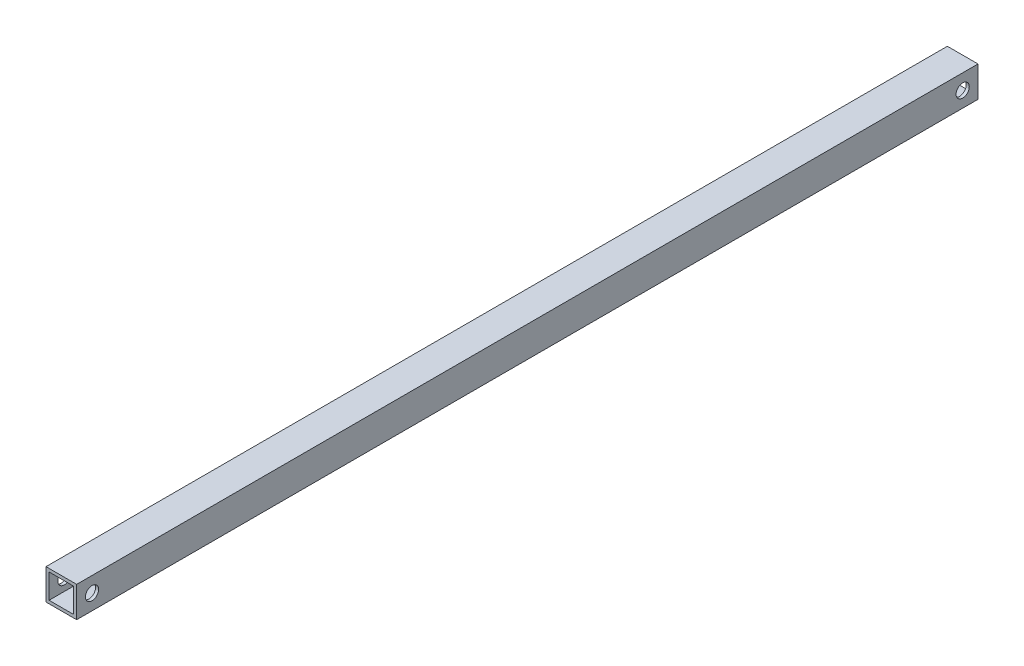
ISO-10303-21;
HEADER;
FILE_DESCRIPTION(('STEP AP214'),'2;1');
FILE_NAME('part.step','',(''),(''),'','','');
FILE_SCHEMA(('AUTOMOTIVE_DESIGN { 1 0 10303 214 1 1 1 1 }'));
ENDSEC;
DATA;
#1=APPLICATION_CONTEXT('core data for automotive mechanical design processes');
#2=APPLICATION_PROTOCOL_DEFINITION('international standard','automotive_design',2000,#1);
#3=PRODUCT_CONTEXT('',#1,'mechanical');
#4=PRODUCT('Part','Part','',(#3));
#5=PRODUCT_RELATED_PRODUCT_CATEGORY('part','',(#4));
#6=PRODUCT_DEFINITION_FORMATION('','',#4);
#7=PRODUCT_DEFINITION_CONTEXT('part definition',#1,'design');
#8=PRODUCT_DEFINITION('design','',#6,#7);
#9=PRODUCT_DEFINITION_SHAPE('','',#8);
#10=(LENGTH_UNIT() NAMED_UNIT(*) SI_UNIT(.MILLI.,.METRE.));
#11=(NAMED_UNIT(*) PLANE_ANGLE_UNIT() SI_UNIT($,.RADIAN.));
#12=(NAMED_UNIT(*) SI_UNIT($,.STERADIAN.) SOLID_ANGLE_UNIT());
#13=UNCERTAINTY_MEASURE_WITH_UNIT(LENGTH_MEASURE(1.E-05),#10,'distance_accuracy_value','');
#14=(GEOMETRIC_REPRESENTATION_CONTEXT(3) GLOBAL_UNCERTAINTY_ASSIGNED_CONTEXT((#13)) GLOBAL_UNIT_ASSIGNED_CONTEXT((#10,
#11,#12)) REPRESENTATION_CONTEXT('',''));
#15=CARTESIAN_POINT('',(0.,0.,0.));
#16=DIRECTION('',(0.,0.,1.));
#17=DIRECTION('',(1.,0.,0.));
#18=AXIS2_PLACEMENT_3D('',#15,#16,#17);
#19=CARTESIAN_POINT('',(0.,0.,294.));
#20=DIRECTION('',(0.,0.,1.));
#21=DIRECTION('',(1.,0.,0.));
#22=AXIS2_PLACEMENT_3D('',#19,#20,#21);
#23=PLANE('',#22);
#24=DIRECTION('',(0.,1.,0.));
#25=VECTOR('',#24,1.);
#26=CARTESIAN_POINT('',(5.,5.,294.));
#27=LINE('',#26,#25);
#28=CARTESIAN_POINT('',(5.,-5.,294.));
#29=VERTEX_POINT('',#28);
#30=CARTESIAN_POINT('',(5.,5.,294.));
#31=VERTEX_POINT('',#30);
#32=EDGE_CURVE('E164',#29,#31,#27,.T.);
#33=ORIENTED_EDGE('',*,*,#32,.T.);
#34=DIRECTION('',(-1.,0.,0.));
#35=VECTOR('',#34,1.);
#36=CARTESIAN_POINT('',(-5.,5.,294.));
#37=LINE('',#36,#35);
#38=CARTESIAN_POINT('',(-5.,5.,294.));
#39=VERTEX_POINT('',#38);
#40=EDGE_CURVE('E167',#31,#39,#37,.T.);
#41=ORIENTED_EDGE('',*,*,#40,.T.);
#42=DIRECTION('',(0.,-1.,0.));
#43=VECTOR('',#42,1.);
#44=CARTESIAN_POINT('',(-5.,5.,294.));
#45=LINE('',#44,#43);
#46=CARTESIAN_POINT('',(-5.,-5.,294.));
#47=VERTEX_POINT('',#46);
#48=EDGE_CURVE('E170',#39,#47,#45,.T.);
#49=ORIENTED_EDGE('',*,*,#48,.T.);
#50=DIRECTION('',(1.,0.,0.));
#51=VECTOR('',#50,1.);
#52=CARTESIAN_POINT('',(-5.,-5.,294.));
#53=LINE('',#52,#51);
#54=EDGE_CURVE('E172',#47,#29,#53,.T.);
#55=ORIENTED_EDGE('',*,*,#54,.T.);
#56=EDGE_LOOP('',(#33,#41,#49,#55));
#57=FACE_BOUND('',#56,.T.);
#58=DIRECTION('',(-1.,0.,0.));
#59=VECTOR('',#58,1.);
#60=CARTESIAN_POINT('',(-5.,4.,294.));
#61=LINE('',#60,#59);
#62=CARTESIAN_POINT('',(4.,4.,294.));
#63=VERTEX_POINT('',#62);
#64=CARTESIAN_POINT('',(-4.,4.,294.));
#65=VERTEX_POINT('',#64);
#66=EDGE_CURVE('E134',#63,#65,#61,.T.);
#67=ORIENTED_EDGE('',*,*,#66,.F.);
#68=DIRECTION('',(0.,1.,0.));
#69=VECTOR('',#68,1.);
#70=CARTESIAN_POINT('',(4.,5.,294.));
#71=LINE('',#70,#69);
#72=CARTESIAN_POINT('',(4.,-4.,294.));
#73=VERTEX_POINT('',#72);
#74=EDGE_CURVE('E126',#73,#63,#71,.T.);
#75=ORIENTED_EDGE('',*,*,#74,.F.);
#76=DIRECTION('',(1.,0.,0.));
#77=VECTOR('',#76,1.);
#78=CARTESIAN_POINT('',(-5.,-4.,294.));
#79=LINE('',#78,#77);
#80=CARTESIAN_POINT('',(-4.,-4.,294.));
#81=VERTEX_POINT('',#80);
#82=EDGE_CURVE('E148',#81,#73,#79,.T.);
#83=ORIENTED_EDGE('',*,*,#82,.F.);
#84=DIRECTION('',(0.,-1.,0.));
#85=VECTOR('',#84,1.);
#86=CARTESIAN_POINT('',(-4.,5.,294.));
#87=LINE('',#86,#85);
#88=EDGE_CURVE('E146',#65,#81,#87,.T.);
#89=ORIENTED_EDGE('',*,*,#88,.F.);
#90=EDGE_LOOP('',(#67,#75,#83,#89));
#91=FACE_BOUND('',#90,.T.);
#92=ADVANCED_FACE('F59',(#57,#91),#23,.T.);
#93=CARTESIAN_POINT('',(0.,0.,0.));
#94=DIRECTION('',(0.,0.,1.));
#95=DIRECTION('',(1.,0.,0.));
#96=AXIS2_PLACEMENT_3D('',#93,#94,#95);
#97=PLANE('',#96);
#98=DIRECTION('',(0.,1.,0.));
#99=VECTOR('',#98,1.);
#100=CARTESIAN_POINT('',(5.,5.,0.));
#101=LINE('',#100,#99);
#102=CARTESIAN_POINT('',(5.,-5.,0.));
#103=VERTEX_POINT('',#102);
#104=CARTESIAN_POINT('',(5.,5.,0.));
#105=VERTEX_POINT('',#104);
#106=EDGE_CURVE('E142',#103,#105,#101,.T.);
#107=ORIENTED_EDGE('',*,*,#106,.F.);
#108=DIRECTION('',(1.,0.,0.));
#109=VECTOR('',#108,1.);
#110=CARTESIAN_POINT('',(-5.,-5.,0.));
#111=LINE('',#110,#109);
#112=CARTESIAN_POINT('',(-5.,-5.,0.));
#113=VERTEX_POINT('',#112);
#114=EDGE_CURVE('E168',#113,#103,#111,.T.);
#115=ORIENTED_EDGE('',*,*,#114,.F.);
#116=DIRECTION('',(0.,-1.,0.));
#117=VECTOR('',#116,1.);
#118=CARTESIAN_POINT('',(-5.,5.,0.));
#119=LINE('',#118,#117);
#120=CARTESIAN_POINT('',(-5.,5.,0.));
#121=VERTEX_POINT('',#120);
#122=EDGE_CURVE('E179',#121,#113,#119,.T.);
#123=ORIENTED_EDGE('',*,*,#122,.F.);
#124=DIRECTION('',(-1.,0.,0.));
#125=VECTOR('',#124,1.);
#126=CARTESIAN_POINT('',(-5.,5.,0.));
#127=LINE('',#126,#125);
#128=EDGE_CURVE('E177',#105,#121,#127,.T.);
#129=ORIENTED_EDGE('',*,*,#128,.F.);
#130=EDGE_LOOP('',(#107,#115,#123,#129));
#131=FACE_BOUND('',#130,.T.);
#132=DIRECTION('',(0.,1.,0.));
#133=VECTOR('',#132,1.);
#134=CARTESIAN_POINT('',(4.,5.,0.));
#135=LINE('',#134,#133);
#136=CARTESIAN_POINT('',(4.,-4.,0.));
#137=VERTEX_POINT('',#136);
#138=CARTESIAN_POINT('',(4.,4.,0.));
#139=VERTEX_POINT('',#138);
#140=EDGE_CURVE('E84',#137,#139,#135,.T.);
#141=ORIENTED_EDGE('',*,*,#140,.T.);
#142=DIRECTION('',(-1.,0.,0.));
#143=VECTOR('',#142,1.);
#144=CARTESIAN_POINT('',(-5.,4.,0.));
#145=LINE('',#144,#143);
#146=CARTESIAN_POINT('',(-4.,4.,0.));
#147=VERTEX_POINT('',#146);
#148=EDGE_CURVE('E141',#139,#147,#145,.T.);
#149=ORIENTED_EDGE('',*,*,#148,.T.);
#150=DIRECTION('',(0.,-1.,0.));
#151=VECTOR('',#150,1.);
#152=CARTESIAN_POINT('',(-4.,5.,0.));
#153=LINE('',#152,#151);
#154=CARTESIAN_POINT('',(-4.,-4.,0.));
#155=VERTEX_POINT('',#154);
#156=EDGE_CURVE('E156',#147,#155,#153,.T.);
#157=ORIENTED_EDGE('',*,*,#156,.T.);
#158=DIRECTION('',(1.,0.,0.));
#159=VECTOR('',#158,1.);
#160=CARTESIAN_POINT('',(-5.,-4.,0.));
#161=LINE('',#160,#159);
#162=EDGE_CURVE('E135',#155,#137,#161,.T.);
#163=ORIENTED_EDGE('',*,*,#162,.T.);
#164=EDGE_LOOP('',(#141,#149,#157,#163));
#165=FACE_BOUND('',#164,.T.);
#166=ADVANCED_FACE('F226',(#131,#165),#97,.F.);
#167=CARTESIAN_POINT('',(5.,5.,294.));
#168=DIRECTION('',(-1.,0.,0.));
#169=DIRECTION('',(0.,-1.,0.));
#170=AXIS2_PLACEMENT_3D('',#167,#168,#169);
#171=PLANE('',#170);
#172=CARTESIAN_POINT('',(5.,0.,5.));
#173=DIRECTION('',(1.,0.,0.));
#174=DIRECTION('',(0.,1.,0.));
#175=AXIS2_PLACEMENT_3D('',#172,#173,#174);
#176=CIRCLE('',#175,2.15);
#177=CARTESIAN_POINT('',(5.,2.15,5.));
#178=VERTEX_POINT('',#177);
#179=EDGE_CURVE('E197',#178,#178,#176,.T.);
#180=ORIENTED_EDGE('',*,*,#179,.F.);
#181=EDGE_LOOP('',(#180));
#182=FACE_BOUND('',#181,.T.);
#183=CARTESIAN_POINT('',(5.,0.,289.));
#184=DIRECTION('',(1.,0.,0.));
#185=DIRECTION('',(0.,-1.,0.));
#186=AXIS2_PLACEMENT_3D('',#183,#184,#185);
#187=CIRCLE('',#186,2.15000000000002);
#188=CARTESIAN_POINT('',(5.,-2.15000000000005,289.));
#189=VERTEX_POINT('',#188);
#190=EDGE_CURVE('E207',#189,#189,#187,.T.);
#191=ORIENTED_EDGE('',*,*,#190,.F.);
#192=EDGE_LOOP('',(#191));
#193=FACE_BOUND('',#192,.T.);
#194=ORIENTED_EDGE('',*,*,#106,.T.);
#195=DIRECTION('',(0.,0.,-1.));
#196=VECTOR('',#195,1.);
#197=CARTESIAN_POINT('',(5.,5.,294.));
#198=LINE('',#197,#196);
#199=EDGE_CURVE('E12',#31,#105,#198,.T.);
#200=ORIENTED_EDGE('',*,*,#199,.F.);
#201=ORIENTED_EDGE('',*,*,#32,.F.);
#202=DIRECTION('',(0.,0.,-1.));
#203=VECTOR('',#202,1.);
#204=CARTESIAN_POINT('',(5.,-5.,294.));
#205=LINE('',#204,#203);
#206=EDGE_CURVE('E174',#29,#103,#205,.T.);
#207=ORIENTED_EDGE('',*,*,#206,.T.);
#208=EDGE_LOOP('',(#194,#200,#201,#207));
#209=FACE_BOUND('',#208,.T.);
#210=ADVANCED_FACE('F61',(#182,#193,#209),#171,.F.);
#211=CARTESIAN_POINT('',(-5.,5.,294.));
#212=DIRECTION('',(0.,-1.,0.));
#213=DIRECTION('',(0.,0.,-1.));
#214=AXIS2_PLACEMENT_3D('',#211,#212,#213);
#215=PLANE('',#214);
#216=ORIENTED_EDGE('',*,*,#128,.T.);
#217=DIRECTION('',(0.,0.,-1.));
#218=VECTOR('',#217,1.);
#219=CARTESIAN_POINT('',(-5.,5.,294.));
#220=LINE('',#219,#218);
#221=EDGE_CURVE('E68',#39,#121,#220,.T.);
#222=ORIENTED_EDGE('',*,*,#221,.F.);
#223=ORIENTED_EDGE('',*,*,#40,.F.);
#224=ORIENTED_EDGE('',*,*,#199,.T.);
#225=EDGE_LOOP('',(#216,#222,#223,#224));
#226=FACE_BOUND('',#225,.T.);
#227=ADVANCED_FACE('F252',(#226),#215,.F.);
#228=CARTESIAN_POINT('',(-5.,5.,294.));
#229=DIRECTION('',(1.,0.,0.));
#230=DIRECTION('',(0.,1.,0.));
#231=AXIS2_PLACEMENT_3D('',#228,#229,#230);
#232=PLANE('',#231);
#233=CARTESIAN_POINT('',(-5.,0.,5.));
#234=DIRECTION('',(1.,0.,0.));
#235=DIRECTION('',(0.,1.,0.));
#236=AXIS2_PLACEMENT_3D('',#233,#234,#235);
#237=CIRCLE('',#236,2.15);
#238=CARTESIAN_POINT('',(-5.,2.15,5.));
#239=VERTEX_POINT('',#238);
#240=EDGE_CURVE('E191',#239,#239,#237,.T.);
#241=ORIENTED_EDGE('',*,*,#240,.T.);
#242=EDGE_LOOP('',(#241));
#243=FACE_BOUND('',#242,.T.);
#244=CARTESIAN_POINT('',(-5.,0.,289.));
#245=DIRECTION('',(1.,0.,0.));
#246=DIRECTION('',(0.,-1.,0.));
#247=AXIS2_PLACEMENT_3D('',#244,#245,#246);
#248=CIRCLE('',#247,2.15000000000002);
#249=CARTESIAN_POINT('',(-5.,-2.15000000000005,289.));
#250=VERTEX_POINT('',#249);
#251=EDGE_CURVE('E202',#250,#250,#248,.T.);
#252=ORIENTED_EDGE('',*,*,#251,.T.);
#253=EDGE_LOOP('',(#252));
#254=FACE_BOUND('',#253,.T.);
#255=ORIENTED_EDGE('',*,*,#122,.T.);
#256=DIRECTION('',(0.,0.,-1.));
#257=VECTOR('',#256,1.);
#258=CARTESIAN_POINT('',(-5.,-5.,294.));
#259=LINE('',#258,#257);
#260=EDGE_CURVE('E184',#47,#113,#259,.T.);
#261=ORIENTED_EDGE('',*,*,#260,.F.);
#262=ORIENTED_EDGE('',*,*,#48,.F.);
#263=ORIENTED_EDGE('',*,*,#221,.T.);
#264=EDGE_LOOP('',(#255,#261,#262,#263));
#265=FACE_BOUND('',#264,.T.);
#266=ADVANCED_FACE('F249',(#243,#254,#265),#232,.F.);
#267=CARTESIAN_POINT('',(-5.,-5.,294.));
#268=DIRECTION('',(0.,1.,0.));
#269=DIRECTION('',(0.,0.,1.));
#270=AXIS2_PLACEMENT_3D('',#267,#268,#269);
#271=PLANE('',#270);
#272=ORIENTED_EDGE('',*,*,#114,.T.);
#273=ORIENTED_EDGE('',*,*,#206,.F.);
#274=ORIENTED_EDGE('',*,*,#54,.F.);
#275=ORIENTED_EDGE('',*,*,#260,.T.);
#276=EDGE_LOOP('',(#272,#273,#274,#275));
#277=FACE_BOUND('',#276,.T.);
#278=ADVANCED_FACE('F246',(#277),#271,.F.);
#279=CARTESIAN_POINT('',(4.,5.,294.));
#280=DIRECTION('',(-1.,0.,0.));
#281=DIRECTION('',(0.,-1.,0.));
#282=AXIS2_PLACEMENT_3D('',#279,#280,#281);
#283=PLANE('',#282);
#284=CARTESIAN_POINT('',(4.,0.,5.));
#285=DIRECTION('',(-1.,0.,0.));
#286=DIRECTION('',(0.,-1.,0.));
#287=AXIS2_PLACEMENT_3D('',#284,#285,#286);
#288=CIRCLE('',#287,2.15);
#289=CARTESIAN_POINT('',(4.,-2.15,5.));
#290=VERTEX_POINT('',#289);
#291=EDGE_CURVE('E154',#290,#290,#288,.T.);
#292=ORIENTED_EDGE('',*,*,#291,.F.);
#293=EDGE_LOOP('',(#292));
#294=FACE_BOUND('',#293,.T.);
#295=CARTESIAN_POINT('',(4.,0.,289.));
#296=DIRECTION('',(-1.,0.,0.));
#297=DIRECTION('',(0.,-1.,0.));
#298=AXIS2_PLACEMENT_3D('',#295,#296,#297);
#299=CIRCLE('',#298,2.15000000000002);
#300=CARTESIAN_POINT('',(4.,-2.15000000000005,289.));
#301=VERTEX_POINT('',#300);
#302=EDGE_CURVE('E190',#301,#301,#299,.T.);
#303=ORIENTED_EDGE('',*,*,#302,.F.);
#304=EDGE_LOOP('',(#303));
#305=FACE_BOUND('',#304,.T.);
#306=ORIENTED_EDGE('',*,*,#140,.F.);
#307=DIRECTION('',(0.,0.,-1.));
#308=VECTOR('',#307,1.);
#309=CARTESIAN_POINT('',(4.,-4.,294.));
#310=LINE('',#309,#308);
#311=EDGE_CURVE('E130',#73,#137,#310,.T.);
#312=ORIENTED_EDGE('',*,*,#311,.F.);
#313=ORIENTED_EDGE('',*,*,#74,.T.);
#314=DIRECTION('',(0.,0.,-1.));
#315=VECTOR('',#314,1.);
#316=CARTESIAN_POINT('',(4.,4.,294.));
#317=LINE('',#316,#315);
#318=EDGE_CURVE('E129',#63,#139,#317,.T.);
#319=ORIENTED_EDGE('',*,*,#318,.T.);
#320=EDGE_LOOP('',(#306,#312,#313,#319));
#321=FACE_BOUND('',#320,.T.);
#322=ADVANCED_FACE('F128',(#294,#305,#321),#283,.T.);
#323=CARTESIAN_POINT('',(-5.,4.,294.));
#324=DIRECTION('',(0.,-1.,0.));
#325=DIRECTION('',(0.,0.,-1.));
#326=AXIS2_PLACEMENT_3D('',#323,#324,#325);
#327=PLANE('',#326);
#328=ORIENTED_EDGE('',*,*,#148,.F.);
#329=ORIENTED_EDGE('',*,*,#318,.F.);
#330=ORIENTED_EDGE('',*,*,#66,.T.);
#331=DIRECTION('',(0.,0.,-1.));
#332=VECTOR('',#331,1.);
#333=CARTESIAN_POINT('',(-4.,4.,294.));
#334=LINE('',#333,#332);
#335=EDGE_CURVE('E143',#65,#147,#334,.T.);
#336=ORIENTED_EDGE('',*,*,#335,.T.);
#337=EDGE_LOOP('',(#328,#329,#330,#336));
#338=FACE_BOUND('',#337,.T.);
#339=ADVANCED_FACE('F138',(#338),#327,.T.);
#340=CARTESIAN_POINT('',(-4.,5.,294.));
#341=DIRECTION('',(1.,0.,0.));
#342=DIRECTION('',(0.,1.,0.));
#343=AXIS2_PLACEMENT_3D('',#340,#341,#342);
#344=PLANE('',#343);
#345=CARTESIAN_POINT('',(-4.,0.,5.));
#346=DIRECTION('',(1.,0.,0.));
#347=DIRECTION('',(0.,1.,0.));
#348=AXIS2_PLACEMENT_3D('',#345,#346,#347);
#349=CIRCLE('',#348,2.15);
#350=CARTESIAN_POINT('',(-4.,2.15,5.));
#351=VERTEX_POINT('',#350);
#352=EDGE_CURVE('E63',#351,#351,#349,.T.);
#353=ORIENTED_EDGE('',*,*,#352,.F.);
#354=EDGE_LOOP('',(#353));
#355=FACE_BOUND('',#354,.T.);
#356=CARTESIAN_POINT('',(-4.,0.,289.));
#357=DIRECTION('',(1.,0.,0.));
#358=DIRECTION('',(0.,1.,0.));
#359=AXIS2_PLACEMENT_3D('',#356,#357,#358);
#360=CIRCLE('',#359,2.15000000000002);
#361=CARTESIAN_POINT('',(-4.,2.14999999999998,289.));
#362=VERTEX_POINT('',#361);
#363=EDGE_CURVE('E188',#362,#362,#360,.T.);
#364=ORIENTED_EDGE('',*,*,#363,.F.);
#365=EDGE_LOOP('',(#364));
#366=FACE_BOUND('',#365,.T.);
#367=ORIENTED_EDGE('',*,*,#156,.F.);
#368=ORIENTED_EDGE('',*,*,#335,.F.);
#369=ORIENTED_EDGE('',*,*,#88,.T.);
#370=DIRECTION('',(0.,0.,-1.));
#371=VECTOR('',#370,1.);
#372=CARTESIAN_POINT('',(-4.,-4.,294.));
#373=LINE('',#372,#371);
#374=EDGE_CURVE('E76',#81,#155,#373,.T.);
#375=ORIENTED_EDGE('',*,*,#374,.T.);
#376=EDGE_LOOP('',(#367,#368,#369,#375));
#377=FACE_BOUND('',#376,.T.);
#378=ADVANCED_FACE('F218',(#355,#366,#377),#344,.T.);
#379=CARTESIAN_POINT('',(-5.,-4.,294.));
#380=DIRECTION('',(0.,1.,0.));
#381=DIRECTION('',(0.,0.,1.));
#382=AXIS2_PLACEMENT_3D('',#379,#380,#381);
#383=PLANE('',#382);
#384=ORIENTED_EDGE('',*,*,#162,.F.);
#385=ORIENTED_EDGE('',*,*,#374,.F.);
#386=ORIENTED_EDGE('',*,*,#82,.T.);
#387=ORIENTED_EDGE('',*,*,#311,.T.);
#388=EDGE_LOOP('',(#384,#385,#386,#387));
#389=FACE_BOUND('',#388,.T.);
#390=ADVANCED_FACE('F221',(#389),#383,.T.);
#391=CARTESIAN_POINT('',(-5.,0.,289.));
#392=DIRECTION('',(1.,0.,0.));
#393=DIRECTION('',(0.,1.,0.));
#394=AXIS2_PLACEMENT_3D('',#391,#392,#393);
#395=CYLINDRICAL_SURFACE('',#394,2.15000000000002);
#396=ORIENTED_EDGE('',*,*,#363,.T.);
#397=EDGE_LOOP('',(#396));
#398=FACE_BOUND('',#397,.T.);
#399=ORIENTED_EDGE('',*,*,#251,.F.);
#400=EDGE_LOOP('',(#399));
#401=FACE_BOUND('',#400,.T.);
#402=ADVANCED_FACE('F228',(#398,#401),#395,.F.);
#403=CARTESIAN_POINT('',(-5.,0.,5.));
#404=DIRECTION('',(1.,0.,0.));
#405=DIRECTION('',(0.,1.,0.));
#406=AXIS2_PLACEMENT_3D('',#403,#404,#405);
#407=CYLINDRICAL_SURFACE('',#406,2.15);
#408=ORIENTED_EDGE('',*,*,#352,.T.);
#409=EDGE_LOOP('',(#408));
#410=FACE_BOUND('',#409,.T.);
#411=ORIENTED_EDGE('',*,*,#240,.F.);
#412=EDGE_LOOP('',(#411));
#413=FACE_BOUND('',#412,.T.);
#414=ADVANCED_FACE('F215',(#410,#413),#407,.F.);
#415=ORIENTED_EDGE('',*,*,#302,.T.);
#416=EDGE_LOOP('',(#415));
#417=FACE_BOUND('',#416,.T.);
#418=ORIENTED_EDGE('',*,*,#190,.T.);
#419=EDGE_LOOP('',(#418));
#420=FACE_BOUND('',#419,.T.);
#421=ADVANCED_FACE('F234',(#417,#420),#395,.F.);
#422=ORIENTED_EDGE('',*,*,#291,.T.);
#423=EDGE_LOOP('',(#422));
#424=FACE_BOUND('',#423,.T.);
#425=ORIENTED_EDGE('',*,*,#179,.T.);
#426=EDGE_LOOP('',(#425));
#427=FACE_BOUND('',#426,.T.);
#428=ADVANCED_FACE('F278',(#424,#427),#407,.F.);
#429=CLOSED_SHELL('',(#92,#166,#210,#227,#266,#278,#322,#339,#378,#390,#402,#414,#421,#428));
#430=MANIFOLD_SOLID_BREP('B2',#429);
#431=ADVANCED_BREP_SHAPE_REPRESENTATION('',(#18,#430),#14);
#432=SHAPE_DEFINITION_REPRESENTATION(#9,#431);
ENDSEC;
END-ISO-10303-21;
